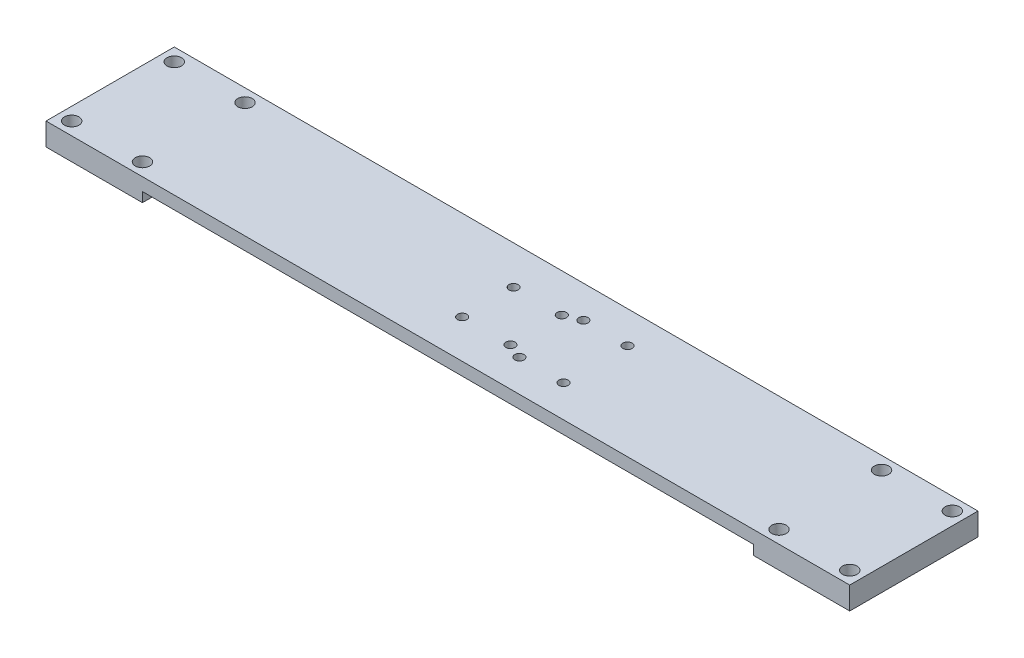
ISO-10303-21;
HEADER;
FILE_DESCRIPTION(('STEP AP214'),'2;1');
FILE_NAME('part.step','',(''),(''),'','','');
FILE_SCHEMA(('AUTOMOTIVE_DESIGN { 1 0 10303 214 1 1 1 1 }'));
ENDSEC;
DATA;
#1=APPLICATION_CONTEXT('core data for automotive mechanical design processes');
#2=APPLICATION_PROTOCOL_DEFINITION('international standard','automotive_design',2000,#1);
#3=PRODUCT_CONTEXT('',#1,'mechanical');
#4=PRODUCT('Part','Part','',(#3));
#5=PRODUCT_RELATED_PRODUCT_CATEGORY('part','',(#4));
#6=PRODUCT_DEFINITION_FORMATION('','',#4);
#7=PRODUCT_DEFINITION_CONTEXT('part definition',#1,'design');
#8=PRODUCT_DEFINITION('design','',#6,#7);
#9=PRODUCT_DEFINITION_SHAPE('','',#8);
#10=(LENGTH_UNIT() NAMED_UNIT(*) SI_UNIT(.MILLI.,.METRE.));
#11=(NAMED_UNIT(*) PLANE_ANGLE_UNIT() SI_UNIT($,.RADIAN.));
#12=(NAMED_UNIT(*) SI_UNIT($,.STERADIAN.) SOLID_ANGLE_UNIT());
#13=UNCERTAINTY_MEASURE_WITH_UNIT(LENGTH_MEASURE(1.E-05),#10,'distance_accuracy_value','');
#14=(GEOMETRIC_REPRESENTATION_CONTEXT(3) GLOBAL_UNCERTAINTY_ASSIGNED_CONTEXT((#13)) GLOBAL_UNIT_ASSIGNED_CONTEXT((#10,
#11,#12)) REPRESENTATION_CONTEXT('',''));
#15=CARTESIAN_POINT('',(0.,0.,0.));
#16=DIRECTION('',(0.,0.,1.));
#17=DIRECTION('',(1.,0.,0.));
#18=AXIS2_PLACEMENT_3D('',#15,#16,#17);
#19=CARTESIAN_POINT('',(0.,0.,0.));
#20=DIRECTION('',(0.,1.,0.));
#21=DIRECTION('',(0.,0.,1.));
#22=AXIS2_PLACEMENT_3D('',#19,#20,#21);
#23=PLANE('',#22);
#24=CARTESIAN_POINT('',(-112.75,3.88578058618805E-13,-29.8999999999996));
#25=DIRECTION('',(0.,-1.,0.));
#26=DIRECTION('',(0.,0.,-1.));
#27=AXIS2_PLACEMENT_3D('',#24,#25,#26);
#28=CIRCLE('',#27,1.45000000000001);
#29=CARTESIAN_POINT('',(-112.75,3.88578058618805E-13,-31.3499999999996));
#30=VERTEX_POINT('',#29);
#31=EDGE_CURVE('E212',#30,#30,#28,.T.);
#32=ORIENTED_EDGE('',*,*,#31,.F.);
#33=EDGE_LOOP('',(#32));
#34=FACE_BOUND('',#33,.T.);
#35=CARTESIAN_POINT('',(-98.9999999999999,3.88578058618805E-13,-9.99999999999993));
#36=DIRECTION('',(0.,-1.,0.));
#37=DIRECTION('',(0.,0.,-1.));
#38=AXIS2_PLACEMENT_3D('',#35,#36,#37);
#39=CIRCLE('',#38,1.44999999999997);
#40=CARTESIAN_POINT('',(-98.9999999999999,3.88578058618805E-13,-11.4499999999999));
#41=VERTEX_POINT('',#40);
#42=EDGE_CURVE('E211',#41,#41,#39,.T.);
#43=ORIENTED_EDGE('',*,*,#42,.F.);
#44=EDGE_LOOP('',(#43));
#45=FACE_BOUND('',#44,.T.);
#46=CARTESIAN_POINT('',(-98.9999999999999,3.88578058618805E-13,-29.8999999999996));
#47=DIRECTION('',(0.,-1.,0.));
#48=DIRECTION('',(0.,0.,-1.));
#49=AXIS2_PLACEMENT_3D('',#46,#47,#48);
#50=CIRCLE('',#49,1.45000000000002);
#51=CARTESIAN_POINT('',(-98.9999999999999,3.88578058618805E-13,-31.3499999999996));
#52=VERTEX_POINT('',#51);
#53=EDGE_CURVE('E208',#52,#52,#50,.T.);
#54=ORIENTED_EDGE('',*,*,#53,.F.);
#55=EDGE_LOOP('',(#54));
#56=FACE_BOUND('',#55,.T.);
#57=CARTESIAN_POINT('',(-112.75,3.88578058618805E-13,-10.));
#58=DIRECTION('',(0.,-1.,0.));
#59=DIRECTION('',(0.,0.,-1.));
#60=AXIS2_PLACEMENT_3D('',#57,#58,#59);
#61=CIRCLE('',#60,1.45000000000003);
#62=CARTESIAN_POINT('',(-112.75,3.88578058618805E-13,-11.45));
#63=VERTEX_POINT('',#62);
#64=EDGE_CURVE('E215',#63,#63,#61,.T.);
#65=ORIENTED_EDGE('',*,*,#64,.F.);
#66=EDGE_LOOP('',(#65));
#67=FACE_BOUND('',#66,.T.);
#68=CARTESIAN_POINT('',(-132.5,0.,-11.95));
#69=DIRECTION('',(0.,1.,0.));
#70=DIRECTION('',(0.,0.,1.));
#71=AXIS2_PLACEMENT_3D('',#68,#69,#70);
#72=CIRCLE('',#71,1.45);
#73=CARTESIAN_POINT('',(-132.5,0.,-10.5));
#74=VERTEX_POINT('',#73);
#75=EDGE_CURVE('E254',#74,#74,#72,.T.);
#76=ORIENTED_EDGE('',*,*,#75,.T.);
#77=EDGE_LOOP('',(#76));
#78=FACE_BOUND('',#77,.T.);
#79=CARTESIAN_POINT('',(-117.5,0.,-11.95));
#80=DIRECTION('',(0.,1.,0.));
#81=DIRECTION('',(0.,0.,1.));
#82=AXIS2_PLACEMENT_3D('',#79,#80,#81);
#83=CIRCLE('',#82,1.45);
#84=CARTESIAN_POINT('',(-117.5,0.,-10.5));
#85=VERTEX_POINT('',#84);
#86=EDGE_CURVE('E264',#85,#85,#83,.T.);
#87=ORIENTED_EDGE('',*,*,#86,.T.);
#88=EDGE_LOOP('',(#87));
#89=FACE_BOUND('',#88,.T.);
#90=CARTESIAN_POINT('',(-117.5,0.,-27.95));
#91=DIRECTION('',(0.,1.,0.));
#92=DIRECTION('',(0.,0.,1.));
#93=AXIS2_PLACEMENT_3D('',#90,#91,#92);
#94=CIRCLE('',#93,1.45);
#95=CARTESIAN_POINT('',(-117.5,0.,-26.5));
#96=VERTEX_POINT('',#95);
#97=EDGE_CURVE('E261',#96,#96,#94,.T.);
#98=ORIENTED_EDGE('',*,*,#97,.T.);
#99=EDGE_LOOP('',(#98));
#100=FACE_BOUND('',#99,.T.);
#101=CARTESIAN_POINT('',(-132.5,0.,-27.95));
#102=DIRECTION('',(0.,1.,0.));
#103=DIRECTION('',(0.,0.,1.));
#104=AXIS2_PLACEMENT_3D('',#101,#102,#103);
#105=CIRCLE('',#104,1.45);
#106=CARTESIAN_POINT('',(-132.5,0.,-26.5));
#107=VERTEX_POINT('',#106);
#108=EDGE_CURVE('E244',#107,#107,#105,.T.);
#109=ORIENTED_EDGE('',*,*,#108,.T.);
#110=EDGE_LOOP('',(#109));
#111=FACE_BOUND('',#110,.T.);
#112=DIRECTION('',(0.,0.,-1.));
#113=VECTOR('',#112,1.);
#114=CARTESIAN_POINT('',(-30.,0.,0.));
#115=LINE('',#114,#113);
#116=CARTESIAN_POINT('',(-30.,0.,0.));
#117=VERTEX_POINT('',#116);
#118=CARTESIAN_POINT('',(-30.,0.,-39.9));
#119=VERTEX_POINT('',#118);
#120=EDGE_CURVE('E170',#117,#119,#115,.T.);
#121=ORIENTED_EDGE('',*,*,#120,.F.);
#122=DIRECTION('',(1.,0.,0.));
#123=VECTOR('',#122,1.);
#124=CARTESIAN_POINT('',(0.,0.,0.));
#125=LINE('',#124,#123);
#126=CARTESIAN_POINT('',(-220.,0.,0.));
#127=VERTEX_POINT('',#126);
#128=EDGE_CURVE('E248',#127,#117,#125,.T.);
#129=ORIENTED_EDGE('',*,*,#128,.F.);
#130=DIRECTION('',(0.,0.,1.));
#131=VECTOR('',#130,1.);
#132=CARTESIAN_POINT('',(-220.,0.,0.));
#133=LINE('',#132,#131);
#134=CARTESIAN_POINT('',(-220.,0.,-39.9));
#135=VERTEX_POINT('',#134);
#136=EDGE_CURVE('E176',#135,#127,#133,.T.);
#137=ORIENTED_EDGE('',*,*,#136,.F.);
#138=DIRECTION('',(-1.,0.,0.));
#139=VECTOR('',#138,1.);
#140=CARTESIAN_POINT('',(0.,0.,-39.9));
#141=LINE('',#140,#139);
#142=EDGE_CURVE('E51',#119,#135,#141,.T.);
#143=ORIENTED_EDGE('',*,*,#142,.F.);
#144=EDGE_LOOP('',(#121,#129,#137,#143));
#145=FACE_BOUND('',#144,.T.);
#146=ADVANCED_FACE('F34',(#34,#45,#56,#67,#78,#89,#100,#111,#145),#23,.F.);
#147=CARTESIAN_POINT('',(0.,4.,0.));
#148=DIRECTION('',(-1.,0.,0.));
#149=DIRECTION('',(0.,0.,1.));
#150=AXIS2_PLACEMENT_3D('',#147,#148,#149);
#151=PLANE('',#150);
#152=DIRECTION('',(0.,-1.,0.));
#153=VECTOR('',#152,1.);
#154=CARTESIAN_POINT('',(0.,4.,0.));
#155=LINE('',#154,#153);
#156=CARTESIAN_POINT('',(0.,4.,0.));
#157=VERTEX_POINT('',#156);
#158=CARTESIAN_POINT('',(0.,-3.,0.));
#159=VERTEX_POINT('',#158);
#160=EDGE_CURVE('E110',#157,#159,#155,.T.);
#161=ORIENTED_EDGE('',*,*,#160,.T.);
#162=DIRECTION('',(0.,0.,1.));
#163=VECTOR('',#162,1.);
#164=CARTESIAN_POINT('',(0.,-3.,-39.9));
#165=LINE('',#164,#163);
#166=CARTESIAN_POINT('',(0.,-3.,-39.9));
#167=VERTEX_POINT('',#166);
#168=EDGE_CURVE('E149',#167,#159,#165,.T.);
#169=ORIENTED_EDGE('',*,*,#168,.F.);
#170=DIRECTION('',(0.,-1.,0.));
#171=VECTOR('',#170,1.);
#172=CARTESIAN_POINT('',(0.,4.,-39.9));
#173=LINE('',#172,#171);
#174=CARTESIAN_POINT('',(0.,4.,-39.9));
#175=VERTEX_POINT('',#174);
#176=EDGE_CURVE('E11',#175,#167,#173,.T.);
#177=ORIENTED_EDGE('',*,*,#176,.F.);
#178=DIRECTION('',(0.,0.,-1.));
#179=VECTOR('',#178,1.);
#180=CARTESIAN_POINT('',(0.,4.,0.));
#181=LINE('',#180,#179);
#182=EDGE_CURVE('E245',#157,#175,#181,.T.);
#183=ORIENTED_EDGE('',*,*,#182,.F.);
#184=EDGE_LOOP('',(#161,#169,#177,#183));
#185=FACE_BOUND('',#184,.T.);
#186=ADVANCED_FACE('F36',(#185),#151,.F.);
#187=CARTESIAN_POINT('',(0.,4.,-39.9));
#188=DIRECTION('',(0.,0.,1.));
#189=DIRECTION('',(1.,0.,0.));
#190=AXIS2_PLACEMENT_3D('',#187,#188,#189);
#191=PLANE('',#190);
#192=ORIENTED_EDGE('',*,*,#176,.T.);
#193=DIRECTION('',(1.,0.,0.));
#194=VECTOR('',#193,1.);
#195=CARTESIAN_POINT('',(-30.,-3.,-39.9));
#196=LINE('',#195,#194);
#197=CARTESIAN_POINT('',(-30.,-3.,-39.9));
#198=VERTEX_POINT('',#197);
#199=EDGE_CURVE('E146',#198,#167,#196,.T.);
#200=ORIENTED_EDGE('',*,*,#199,.F.);
#201=DIRECTION('',(0.,1.,0.));
#202=VECTOR('',#201,1.);
#203=CARTESIAN_POINT('',(-30.,-1.,-39.9));
#204=LINE('',#203,#202);
#205=EDGE_CURVE('E172',#198,#119,#204,.T.);
#206=ORIENTED_EDGE('',*,*,#205,.T.);
#207=ORIENTED_EDGE('',*,*,#142,.T.);
#208=DIRECTION('',(0.,1.,0.));
#209=VECTOR('',#208,1.);
#210=CARTESIAN_POINT('',(-220.,-1.,-39.9));
#211=LINE('',#210,#209);
#212=CARTESIAN_POINT('',(-220.,-3.,-39.9));
#213=VERTEX_POINT('',#212);
#214=EDGE_CURVE('E181',#213,#135,#211,.T.);
#215=ORIENTED_EDGE('',*,*,#214,.F.);
#216=DIRECTION('',(1.,0.,0.));
#217=VECTOR('',#216,1.);
#218=CARTESIAN_POINT('',(-250.,-3.,-39.9));
#219=LINE('',#218,#217);
#220=CARTESIAN_POINT('',(-250.,-3.,-39.9));
#221=VERTEX_POINT('',#220);
#222=EDGE_CURVE('E119',#221,#213,#219,.T.);
#223=ORIENTED_EDGE('',*,*,#222,.F.);
#224=DIRECTION('',(0.,-1.,0.));
#225=VECTOR('',#224,1.);
#226=CARTESIAN_POINT('',(-250.,4.,-39.9));
#227=LINE('',#226,#225);
#228=CARTESIAN_POINT('',(-250.,4.,-39.9));
#229=VERTEX_POINT('',#228);
#230=EDGE_CURVE('E43',#229,#221,#227,.T.);
#231=ORIENTED_EDGE('',*,*,#230,.F.);
#232=DIRECTION('',(-1.,0.,0.));
#233=VECTOR('',#232,1.);
#234=CARTESIAN_POINT('',(0.,4.,-39.9));
#235=LINE('',#234,#233);
#236=EDGE_CURVE('E247',#175,#229,#235,.T.);
#237=ORIENTED_EDGE('',*,*,#236,.F.);
#238=EDGE_LOOP('',(#192,#200,#206,#207,#215,#223,#231,#237));
#239=FACE_BOUND('',#238,.T.);
#240=ADVANCED_FACE('F307',(#239),#191,.F.);
#241=CARTESIAN_POINT('',(-250.,4.,0.));
#242=DIRECTION('',(1.,0.,0.));
#243=DIRECTION('',(0.,0.,-1.));
#244=AXIS2_PLACEMENT_3D('',#241,#242,#243);
#245=PLANE('',#244);
#246=ORIENTED_EDGE('',*,*,#230,.T.);
#247=DIRECTION('',(0.,0.,-1.));
#248=VECTOR('',#247,1.);
#249=CARTESIAN_POINT('',(-250.,-3.,0.));
#250=LINE('',#249,#248);
#251=CARTESIAN_POINT('',(-250.,-3.,0.));
#252=VERTEX_POINT('',#251);
#253=EDGE_CURVE('E113',#252,#221,#250,.T.);
#254=ORIENTED_EDGE('',*,*,#253,.F.);
#255=DIRECTION('',(0.,-1.,0.));
#256=VECTOR('',#255,1.);
#257=CARTESIAN_POINT('',(-250.,4.,0.));
#258=LINE('',#257,#256);
#259=CARTESIAN_POINT('',(-250.,4.,0.));
#260=VERTEX_POINT('',#259);
#261=EDGE_CURVE('E102',#260,#252,#258,.T.);
#262=ORIENTED_EDGE('',*,*,#261,.F.);
#263=DIRECTION('',(0.,0.,1.));
#264=VECTOR('',#263,1.);
#265=CARTESIAN_POINT('',(-250.,4.,0.));
#266=LINE('',#265,#264);
#267=EDGE_CURVE('E250',#229,#260,#266,.T.);
#268=ORIENTED_EDGE('',*,*,#267,.F.);
#269=EDGE_LOOP('',(#246,#254,#262,#268));
#270=FACE_BOUND('',#269,.T.);
#271=ADVANCED_FACE('F114',(#270),#245,.F.);
#272=CARTESIAN_POINT('',(0.,4.,0.));
#273=DIRECTION('',(0.,0.,-1.));
#274=DIRECTION('',(-1.,0.,0.));
#275=AXIS2_PLACEMENT_3D('',#272,#273,#274);
#276=PLANE('',#275);
#277=ORIENTED_EDGE('',*,*,#261,.T.);
#278=DIRECTION('',(-1.,0.,0.));
#279=VECTOR('',#278,1.);
#280=CARTESIAN_POINT('',(-220.,-3.,0.));
#281=LINE('',#280,#279);
#282=CARTESIAN_POINT('',(-220.,-3.,0.));
#283=VERTEX_POINT('',#282);
#284=EDGE_CURVE('E107',#283,#252,#281,.T.);
#285=ORIENTED_EDGE('',*,*,#284,.F.);
#286=DIRECTION('',(0.,1.,0.));
#287=VECTOR('',#286,1.);
#288=CARTESIAN_POINT('',(-220.,-1.,0.));
#289=LINE('',#288,#287);
#290=EDGE_CURVE('E179',#283,#127,#289,.T.);
#291=ORIENTED_EDGE('',*,*,#290,.T.);
#292=ORIENTED_EDGE('',*,*,#128,.T.);
#293=DIRECTION('',(0.,1.,0.));
#294=VECTOR('',#293,1.);
#295=CARTESIAN_POINT('',(-30.,-1.,0.));
#296=LINE('',#295,#294);
#297=CARTESIAN_POINT('',(-30.,-3.,0.));
#298=VERTEX_POINT('',#297);
#299=EDGE_CURVE('E174',#298,#117,#296,.T.);
#300=ORIENTED_EDGE('',*,*,#299,.F.);
#301=DIRECTION('',(-1.,0.,0.));
#302=VECTOR('',#301,1.);
#303=CARTESIAN_POINT('',(0.,-3.,0.));
#304=LINE('',#303,#302);
#305=EDGE_CURVE('E152',#159,#298,#304,.T.);
#306=ORIENTED_EDGE('',*,*,#305,.F.);
#307=ORIENTED_EDGE('',*,*,#160,.F.);
#308=DIRECTION('',(1.,0.,0.));
#309=VECTOR('',#308,1.);
#310=CARTESIAN_POINT('',(0.,4.,0.));
#311=LINE('',#310,#309);
#312=EDGE_CURVE('E59',#260,#157,#311,.T.);
#313=ORIENTED_EDGE('',*,*,#312,.F.);
#314=EDGE_LOOP('',(#277,#285,#291,#292,#300,#306,#307,#313));
#315=FACE_BOUND('',#314,.T.);
#316=ADVANCED_FACE('F104',(#315),#276,.F.);
#317=CARTESIAN_POINT('',(0.,4.,0.));
#318=DIRECTION('',(0.,1.,0.));
#319=DIRECTION('',(0.,0.,1.));
#320=AXIS2_PLACEMENT_3D('',#317,#318,#319);
#321=PLANE('',#320);
#322=CARTESIAN_POINT('',(-4.,4.,-3.99999999999998));
#323=DIRECTION('',(0.,1.,0.));
#324=DIRECTION('',(0.,0.,1.));
#325=AXIS2_PLACEMENT_3D('',#322,#323,#324);
#326=CIRCLE('',#325,2.25);
#327=CARTESIAN_POINT('',(-4.,4.,-1.74999999999998));
#328=VERTEX_POINT('',#327);
#329=EDGE_CURVE('E188',#328,#328,#326,.T.);
#330=ORIENTED_EDGE('',*,*,#329,.F.);
#331=EDGE_LOOP('',(#330));
#332=FACE_BOUND('',#331,.T.);
#333=CARTESIAN_POINT('',(-246.,4.,-4.00000000000005));
#334=DIRECTION('',(0.,1.,0.));
#335=DIRECTION('',(0.,0.,-1.));
#336=AXIS2_PLACEMENT_3D('',#333,#334,#335);
#337=CIRCLE('',#336,2.25000000000001);
#338=CARTESIAN_POINT('',(-246.,4.,-6.25000000000006));
#339=VERTEX_POINT('',#338);
#340=EDGE_CURVE('E194',#339,#339,#337,.T.);
#341=ORIENTED_EDGE('',*,*,#340,.F.);
#342=EDGE_LOOP('',(#341));
#343=FACE_BOUND('',#342,.T.);
#344=CARTESIAN_POINT('',(-224.,4.,-4.00000000000005));
#345=DIRECTION('',(0.,1.,0.));
#346=DIRECTION('',(0.,0.,-1.));
#347=AXIS2_PLACEMENT_3D('',#344,#345,#346);
#348=CIRCLE('',#347,2.25000000000001);
#349=CARTESIAN_POINT('',(-224.,4.,-6.25000000000006));
#350=VERTEX_POINT('',#349);
#351=EDGE_CURVE('E197',#350,#350,#348,.T.);
#352=ORIENTED_EDGE('',*,*,#351,.F.);
#353=EDGE_LOOP('',(#352));
#354=FACE_BOUND('',#353,.T.);
#355=CARTESIAN_POINT('',(-224.,4.,-35.8999999999999));
#356=DIRECTION('',(0.,1.,0.));
#357=DIRECTION('',(0.,0.,1.));
#358=AXIS2_PLACEMENT_3D('',#355,#356,#357);
#359=CIRCLE('',#358,2.25000000000001);
#360=CARTESIAN_POINT('',(-224.,4.,-33.6499999999999));
#361=VERTEX_POINT('',#360);
#362=EDGE_CURVE('E200',#361,#361,#359,.T.);
#363=ORIENTED_EDGE('',*,*,#362,.F.);
#364=EDGE_LOOP('',(#363));
#365=FACE_BOUND('',#364,.T.);
#366=CARTESIAN_POINT('',(-26.,4.,-3.99999999999998));
#367=DIRECTION('',(0.,1.,0.));
#368=DIRECTION('',(0.,0.,1.));
#369=AXIS2_PLACEMENT_3D('',#366,#367,#368);
#370=CIRCLE('',#369,2.25);
#371=CARTESIAN_POINT('',(-26.,4.,-1.74999999999998));
#372=VERTEX_POINT('',#371);
#373=EDGE_CURVE('E185',#372,#372,#370,.T.);
#374=ORIENTED_EDGE('',*,*,#373,.F.);
#375=EDGE_LOOP('',(#374));
#376=FACE_BOUND('',#375,.T.);
#377=CARTESIAN_POINT('',(-26.,4.,-35.9));
#378=DIRECTION('',(0.,1.,0.));
#379=DIRECTION('',(0.,0.,-1.));
#380=AXIS2_PLACEMENT_3D('',#377,#378,#379);
#381=CIRCLE('',#380,2.25);
#382=CARTESIAN_POINT('',(-26.,4.,-38.15));
#383=VERTEX_POINT('',#382);
#384=EDGE_CURVE('E189',#383,#383,#381,.T.);
#385=ORIENTED_EDGE('',*,*,#384,.F.);
#386=EDGE_LOOP('',(#385));
#387=FACE_BOUND('',#386,.T.);
#388=CARTESIAN_POINT('',(-4.,4.,-35.9));
#389=DIRECTION('',(0.,1.,0.));
#390=DIRECTION('',(0.,0.,-1.));
#391=AXIS2_PLACEMENT_3D('',#388,#389,#390);
#392=CIRCLE('',#391,2.25);
#393=CARTESIAN_POINT('',(-4.,4.,-38.15));
#394=VERTEX_POINT('',#393);
#395=EDGE_CURVE('E184',#394,#394,#392,.T.);
#396=ORIENTED_EDGE('',*,*,#395,.F.);
#397=EDGE_LOOP('',(#396));
#398=FACE_BOUND('',#397,.T.);
#399=CARTESIAN_POINT('',(-246.,4.,-35.8999999999999));
#400=DIRECTION('',(0.,1.,0.));
#401=DIRECTION('',(0.,0.,1.));
#402=AXIS2_PLACEMENT_3D('',#399,#400,#401);
#403=CIRCLE('',#402,2.25000000000001);
#404=CARTESIAN_POINT('',(-246.,4.,-33.6499999999999));
#405=VERTEX_POINT('',#404);
#406=EDGE_CURVE('E203',#405,#405,#403,.T.);
#407=ORIENTED_EDGE('',*,*,#406,.F.);
#408=EDGE_LOOP('',(#407));
#409=FACE_BOUND('',#408,.T.);
#410=CARTESIAN_POINT('',(-112.75,4.,-29.8999999999996));
#411=DIRECTION('',(0.,1.,0.));
#412=DIRECTION('',(0.,0.,1.));
#413=AXIS2_PLACEMENT_3D('',#410,#411,#412);
#414=CIRCLE('',#413,1.45000000000001);
#415=CARTESIAN_POINT('',(-112.75,4.,-28.4499999999996));
#416=VERTEX_POINT('',#415);
#417=EDGE_CURVE('E229',#416,#416,#414,.T.);
#418=ORIENTED_EDGE('',*,*,#417,.F.);
#419=EDGE_LOOP('',(#418));
#420=FACE_BOUND('',#419,.T.);
#421=CARTESIAN_POINT('',(-98.9999999999999,4.,-9.99999999999993));
#422=DIRECTION('',(0.,1.,0.));
#423=DIRECTION('',(0.,0.,1.));
#424=AXIS2_PLACEMENT_3D('',#421,#422,#423);
#425=CIRCLE('',#424,1.44999999999997);
#426=CARTESIAN_POINT('',(-98.9999999999999,4.,-8.54999999999995));
#427=VERTEX_POINT('',#426);
#428=EDGE_CURVE('E226',#427,#427,#425,.T.);
#429=ORIENTED_EDGE('',*,*,#428,.F.);
#430=EDGE_LOOP('',(#429));
#431=FACE_BOUND('',#430,.T.);
#432=CARTESIAN_POINT('',(-98.9999999999999,4.,-29.8999999999996));
#433=DIRECTION('',(0.,1.,0.));
#434=DIRECTION('',(0.,0.,1.));
#435=AXIS2_PLACEMENT_3D('',#432,#433,#434);
#436=CIRCLE('',#435,1.45000000000002);
#437=CARTESIAN_POINT('',(-98.9999999999999,4.,-28.4499999999995));
#438=VERTEX_POINT('',#437);
#439=EDGE_CURVE('E223',#438,#438,#436,.T.);
#440=ORIENTED_EDGE('',*,*,#439,.F.);
#441=EDGE_LOOP('',(#440));
#442=FACE_BOUND('',#441,.T.);
#443=CARTESIAN_POINT('',(-112.75,4.,-10.));
#444=DIRECTION('',(0.,1.,0.));
#445=DIRECTION('',(0.,0.,1.));
#446=AXIS2_PLACEMENT_3D('',#443,#444,#445);
#447=CIRCLE('',#446,1.45000000000003);
#448=CARTESIAN_POINT('',(-112.75,4.,-8.54999999999998));
#449=VERTEX_POINT('',#448);
#450=EDGE_CURVE('E220',#449,#449,#447,.T.);
#451=ORIENTED_EDGE('',*,*,#450,.F.);
#452=EDGE_LOOP('',(#451));
#453=FACE_BOUND('',#452,.T.);
#454=CARTESIAN_POINT('',(-132.5,4.,-11.95));
#455=DIRECTION('',(0.,1.,0.));
#456=DIRECTION('',(0.,0.,1.));
#457=AXIS2_PLACEMENT_3D('',#454,#455,#456);
#458=CIRCLE('',#457,1.45);
#459=CARTESIAN_POINT('',(-132.5,4.,-10.5));
#460=VERTEX_POINT('',#459);
#461=EDGE_CURVE('E232',#460,#460,#458,.T.);
#462=ORIENTED_EDGE('',*,*,#461,.F.);
#463=EDGE_LOOP('',(#462));
#464=FACE_BOUND('',#463,.T.);
#465=CARTESIAN_POINT('',(-117.5,4.,-11.95));
#466=DIRECTION('',(0.,1.,0.));
#467=DIRECTION('',(0.,0.,1.));
#468=AXIS2_PLACEMENT_3D('',#465,#466,#467);
#469=CIRCLE('',#468,1.45);
#470=CARTESIAN_POINT('',(-117.5,4.,-10.5));
#471=VERTEX_POINT('',#470);
#472=EDGE_CURVE('E237',#471,#471,#469,.T.);
#473=ORIENTED_EDGE('',*,*,#472,.F.);
#474=EDGE_LOOP('',(#473));
#475=FACE_BOUND('',#474,.T.);
#476=CARTESIAN_POINT('',(-117.5,4.,-27.95));
#477=DIRECTION('',(0.,1.,0.));
#478=DIRECTION('',(0.,0.,1.));
#479=AXIS2_PLACEMENT_3D('',#476,#477,#478);
#480=CIRCLE('',#479,1.45);
#481=CARTESIAN_POINT('',(-117.5,4.,-26.5));
#482=VERTEX_POINT('',#481);
#483=EDGE_CURVE('E233',#482,#482,#480,.T.);
#484=ORIENTED_EDGE('',*,*,#483,.F.);
#485=EDGE_LOOP('',(#484));
#486=FACE_BOUND('',#485,.T.);
#487=CARTESIAN_POINT('',(-132.5,4.,-27.95));
#488=DIRECTION('',(0.,1.,0.));
#489=DIRECTION('',(0.,0.,1.));
#490=AXIS2_PLACEMENT_3D('',#487,#488,#489);
#491=CIRCLE('',#490,1.45);
#492=CARTESIAN_POINT('',(-132.5,4.,-26.5));
#493=VERTEX_POINT('',#492);
#494=EDGE_CURVE('E236',#493,#493,#491,.T.);
#495=ORIENTED_EDGE('',*,*,#494,.F.);
#496=EDGE_LOOP('',(#495));
#497=FACE_BOUND('',#496,.T.);
#498=ORIENTED_EDGE('',*,*,#182,.T.);
#499=ORIENTED_EDGE('',*,*,#236,.T.);
#500=ORIENTED_EDGE('',*,*,#267,.T.);
#501=ORIENTED_EDGE('',*,*,#312,.T.);
#502=EDGE_LOOP('',(#498,#499,#500,#501));
#503=FACE_BOUND('',#502,.T.);
#504=ADVANCED_FACE('F316',(#332,#343,#354,#365,#376,#387,#398,#409,#420,#431,#442,#453,#464,
#475,#486,#497,#503),#321,.T.);
#505=CARTESIAN_POINT('',(-132.5,-8.,-27.95));
#506=DIRECTION('',(0.,1.,0.));
#507=DIRECTION('',(0.,0.,1.));
#508=AXIS2_PLACEMENT_3D('',#505,#506,#507);
#509=CYLINDRICAL_SURFACE('',#508,1.45);
#510=ORIENTED_EDGE('',*,*,#494,.T.);
#511=EDGE_LOOP('',(#510));
#512=FACE_BOUND('',#511,.T.);
#513=ORIENTED_EDGE('',*,*,#108,.F.);
#514=EDGE_LOOP('',(#513));
#515=FACE_BOUND('',#514,.T.);
#516=ADVANCED_FACE('F318',(#512,#515),#509,.F.);
#517=CARTESIAN_POINT('',(-117.5,-8.,-27.95));
#518=DIRECTION('',(0.,1.,0.));
#519=DIRECTION('',(0.,0.,1.));
#520=AXIS2_PLACEMENT_3D('',#517,#518,#519);
#521=CYLINDRICAL_SURFACE('',#520,1.45);
#522=ORIENTED_EDGE('',*,*,#483,.T.);
#523=EDGE_LOOP('',(#522));
#524=FACE_BOUND('',#523,.T.);
#525=ORIENTED_EDGE('',*,*,#97,.F.);
#526=EDGE_LOOP('',(#525));
#527=FACE_BOUND('',#526,.T.);
#528=ADVANCED_FACE('F325',(#524,#527),#521,.F.);
#529=CARTESIAN_POINT('',(-117.5,-8.,-11.95));
#530=DIRECTION('',(0.,1.,0.));
#531=DIRECTION('',(0.,0.,1.));
#532=AXIS2_PLACEMENT_3D('',#529,#530,#531);
#533=CYLINDRICAL_SURFACE('',#532,1.45);
#534=ORIENTED_EDGE('',*,*,#472,.T.);
#535=EDGE_LOOP('',(#534));
#536=FACE_BOUND('',#535,.T.);
#537=ORIENTED_EDGE('',*,*,#86,.F.);
#538=EDGE_LOOP('',(#537));
#539=FACE_BOUND('',#538,.T.);
#540=ADVANCED_FACE('F596',(#536,#539),#533,.F.);
#541=CARTESIAN_POINT('',(-132.5,-8.,-11.95));
#542=DIRECTION('',(0.,1.,0.));
#543=DIRECTION('',(0.,0.,1.));
#544=AXIS2_PLACEMENT_3D('',#541,#542,#543);
#545=CYLINDRICAL_SURFACE('',#544,1.45);
#546=ORIENTED_EDGE('',*,*,#461,.T.);
#547=EDGE_LOOP('',(#546));
#548=FACE_BOUND('',#547,.T.);
#549=ORIENTED_EDGE('',*,*,#75,.F.);
#550=EDGE_LOOP('',(#549));
#551=FACE_BOUND('',#550,.T.);
#552=ADVANCED_FACE('F592',(#548,#551),#545,.F.);
#553=CARTESIAN_POINT('',(-112.75,12.0000000000004,-10.));
#554=DIRECTION('',(0.,-1.,0.));
#555=DIRECTION('',(0.,0.,-1.));
#556=AXIS2_PLACEMENT_3D('',#553,#554,#555);
#557=CYLINDRICAL_SURFACE('',#556,1.45000000000003);
#558=ORIENTED_EDGE('',*,*,#450,.T.);
#559=EDGE_LOOP('',(#558));
#560=FACE_BOUND('',#559,.T.);
#561=ORIENTED_EDGE('',*,*,#64,.T.);
#562=EDGE_LOOP('',(#561));
#563=FACE_BOUND('',#562,.T.);
#564=ADVANCED_FACE('F582',(#560,#563),#557,.F.);
#565=CARTESIAN_POINT('',(-98.9999999999999,12.0000000000004,-29.8999999999996));
#566=DIRECTION('',(0.,-1.,0.));
#567=DIRECTION('',(0.,0.,-1.));
#568=AXIS2_PLACEMENT_3D('',#565,#566,#567);
#569=CYLINDRICAL_SURFACE('',#568,1.45000000000002);
#570=ORIENTED_EDGE('',*,*,#439,.T.);
#571=EDGE_LOOP('',(#570));
#572=FACE_BOUND('',#571,.T.);
#573=ORIENTED_EDGE('',*,*,#53,.T.);
#574=EDGE_LOOP('',(#573));
#575=FACE_BOUND('',#574,.T.);
#576=ADVANCED_FACE('F578',(#572,#575),#569,.F.);
#577=CARTESIAN_POINT('',(-98.9999999999999,12.0000000000004,-9.99999999999993));
#578=DIRECTION('',(0.,-1.,0.));
#579=DIRECTION('',(0.,0.,-1.));
#580=AXIS2_PLACEMENT_3D('',#577,#578,#579);
#581=CYLINDRICAL_SURFACE('',#580,1.44999999999997);
#582=ORIENTED_EDGE('',*,*,#428,.T.);
#583=EDGE_LOOP('',(#582));
#584=FACE_BOUND('',#583,.T.);
#585=ORIENTED_EDGE('',*,*,#42,.T.);
#586=EDGE_LOOP('',(#585));
#587=FACE_BOUND('',#586,.T.);
#588=ADVANCED_FACE('F581',(#584,#587),#581,.F.);
#589=CARTESIAN_POINT('',(-112.75,12.0000000000004,-29.8999999999996));
#590=DIRECTION('',(0.,-1.,0.));
#591=DIRECTION('',(0.,0.,-1.));
#592=AXIS2_PLACEMENT_3D('',#589,#590,#591);
#593=CYLINDRICAL_SURFACE('',#592,1.45000000000001);
#594=ORIENTED_EDGE('',*,*,#417,.T.);
#595=EDGE_LOOP('',(#594));
#596=FACE_BOUND('',#595,.T.);
#597=ORIENTED_EDGE('',*,*,#31,.T.);
#598=EDGE_LOOP('',(#597));
#599=FACE_BOUND('',#598,.T.);
#600=ADVANCED_FACE('F576',(#596,#599),#593,.F.);
#601=CARTESIAN_POINT('',(-246.,-16.,-35.8999999999999));
#602=DIRECTION('',(0.,1.,0.));
#603=DIRECTION('',(0.,0.,1.));
#604=AXIS2_PLACEMENT_3D('',#601,#602,#603);
#605=CYLINDRICAL_SURFACE('',#604,2.25000000000001);
#606=ORIENTED_EDGE('',*,*,#406,.T.);
#607=EDGE_LOOP('',(#606));
#608=FACE_BOUND('',#607,.T.);
#609=CARTESIAN_POINT('',(-246.,-1.,-35.8999999999999));
#610=DIRECTION('',(0.,-1.,0.));
#611=DIRECTION('',(0.,0.,-1.));
#612=AXIS2_PLACEMENT_3D('',#609,#610,#611);
#613=CIRCLE('',#612,2.25000000000001);
#614=CARTESIAN_POINT('',(-246.,-1.,-38.1499999999999));
#615=VERTEX_POINT('',#614);
#616=EDGE_CURVE('E143',#615,#615,#613,.F.);
#617=ORIENTED_EDGE('',*,*,#616,.F.);
#618=EDGE_LOOP('',(#617));
#619=FACE_BOUND('',#618,.T.);
#620=ADVANCED_FACE('F559',(#608,#619),#605,.F.);
#621=CARTESIAN_POINT('',(-4.,-16.,-35.9));
#622=DIRECTION('',(0.,1.,0.));
#623=DIRECTION('',(0.,0.,1.));
#624=AXIS2_PLACEMENT_3D('',#621,#622,#623);
#625=CYLINDRICAL_SURFACE('',#624,2.25);
#626=ORIENTED_EDGE('',*,*,#395,.T.);
#627=EDGE_LOOP('',(#626));
#628=FACE_BOUND('',#627,.T.);
#629=CARTESIAN_POINT('',(-4.,-1.,-35.9));
#630=DIRECTION('',(0.,-1.,0.));
#631=DIRECTION('',(0.,0.,-1.));
#632=AXIS2_PLACEMENT_3D('',#629,#630,#631);
#633=CIRCLE('',#632,2.25);
#634=CARTESIAN_POINT('',(-4.,-1.,-38.15));
#635=VERTEX_POINT('',#634);
#636=EDGE_CURVE('E167',#635,#635,#633,.F.);
#637=ORIENTED_EDGE('',*,*,#636,.F.);
#638=EDGE_LOOP('',(#637));
#639=FACE_BOUND('',#638,.T.);
#640=ADVANCED_FACE('F555',(#628,#639),#625,.F.);
#641=CARTESIAN_POINT('',(-26.,-16.,-35.9));
#642=DIRECTION('',(0.,1.,0.));
#643=DIRECTION('',(0.,0.,1.));
#644=AXIS2_PLACEMENT_3D('',#641,#642,#643);
#645=CYLINDRICAL_SURFACE('',#644,2.25);
#646=ORIENTED_EDGE('',*,*,#384,.T.);
#647=EDGE_LOOP('',(#646));
#648=FACE_BOUND('',#647,.T.);
#649=CARTESIAN_POINT('',(-26.,-1.,-35.9));
#650=DIRECTION('',(0.,-1.,0.));
#651=DIRECTION('',(0.,0.,-1.));
#652=AXIS2_PLACEMENT_3D('',#649,#650,#651);
#653=CIRCLE('',#652,2.25);
#654=CARTESIAN_POINT('',(-26.,-1.,-38.15));
#655=VERTEX_POINT('',#654);
#656=EDGE_CURVE('E164',#655,#655,#653,.F.);
#657=ORIENTED_EDGE('',*,*,#656,.F.);
#658=EDGE_LOOP('',(#657));
#659=FACE_BOUND('',#658,.T.);
#660=ADVANCED_FACE('F551',(#648,#659),#645,.F.);
#661=CARTESIAN_POINT('',(-26.,-16.,-3.99999999999998));
#662=DIRECTION('',(0.,1.,0.));
#663=DIRECTION('',(0.,0.,1.));
#664=AXIS2_PLACEMENT_3D('',#661,#662,#663);
#665=CYLINDRICAL_SURFACE('',#664,2.25);
#666=ORIENTED_EDGE('',*,*,#373,.T.);
#667=EDGE_LOOP('',(#666));
#668=FACE_BOUND('',#667,.T.);
#669=CARTESIAN_POINT('',(-26.,-1.,-3.99999999999998));
#670=DIRECTION('',(0.,-1.,0.));
#671=DIRECTION('',(0.,0.,-1.));
#672=AXIS2_PLACEMENT_3D('',#669,#670,#671);
#673=CIRCLE('',#672,2.25);
#674=CARTESIAN_POINT('',(-26.,-1.,-6.24999999999998));
#675=VERTEX_POINT('',#674);
#676=EDGE_CURVE('E161',#675,#675,#673,.F.);
#677=ORIENTED_EDGE('',*,*,#676,.F.);
#678=EDGE_LOOP('',(#677));
#679=FACE_BOUND('',#678,.T.);
#680=ADVANCED_FACE('F547',(#668,#679),#665,.F.);
#681=CARTESIAN_POINT('',(-224.,-16.,-35.8999999999999));
#682=DIRECTION('',(0.,1.,0.));
#683=DIRECTION('',(0.,0.,1.));
#684=AXIS2_PLACEMENT_3D('',#681,#682,#683);
#685=CYLINDRICAL_SURFACE('',#684,2.25000000000001);
#686=ORIENTED_EDGE('',*,*,#362,.T.);
#687=EDGE_LOOP('',(#686));
#688=FACE_BOUND('',#687,.T.);
#689=CARTESIAN_POINT('',(-224.,-1.,-35.8999999999999));
#690=DIRECTION('',(0.,-1.,0.));
#691=DIRECTION('',(0.,0.,-1.));
#692=AXIS2_PLACEMENT_3D('',#689,#690,#691);
#693=CIRCLE('',#692,2.25000000000001);
#694=CARTESIAN_POINT('',(-224.,-1.,-38.1499999999999));
#695=VERTEX_POINT('',#694);
#696=EDGE_CURVE('E140',#695,#695,#693,.F.);
#697=ORIENTED_EDGE('',*,*,#696,.F.);
#698=EDGE_LOOP('',(#697));
#699=FACE_BOUND('',#698,.T.);
#700=ADVANCED_FACE('F550',(#688,#699),#685,.F.);
#701=CARTESIAN_POINT('',(-224.,-16.,-4.00000000000005));
#702=DIRECTION('',(0.,1.,0.));
#703=DIRECTION('',(0.,0.,1.));
#704=AXIS2_PLACEMENT_3D('',#701,#702,#703);
#705=CYLINDRICAL_SURFACE('',#704,2.25000000000001);
#706=ORIENTED_EDGE('',*,*,#351,.T.);
#707=EDGE_LOOP('',(#706));
#708=FACE_BOUND('',#707,.T.);
#709=CARTESIAN_POINT('',(-224.,-1.,-4.00000000000005));
#710=DIRECTION('',(0.,-1.,0.));
#711=DIRECTION('',(0.,0.,-1.));
#712=AXIS2_PLACEMENT_3D('',#709,#710,#711);
#713=CIRCLE('',#712,2.25000000000001);
#714=CARTESIAN_POINT('',(-224.,-1.,-6.25000000000006));
#715=VERTEX_POINT('',#714);
#716=EDGE_CURVE('E137',#715,#715,#713,.F.);
#717=ORIENTED_EDGE('',*,*,#716,.F.);
#718=EDGE_LOOP('',(#717));
#719=FACE_BOUND('',#718,.T.);
#720=ADVANCED_FACE('F564',(#708,#719),#705,.F.);
#721=CARTESIAN_POINT('',(-246.,-16.,-4.00000000000005));
#722=DIRECTION('',(0.,1.,0.));
#723=DIRECTION('',(0.,0.,1.));
#724=AXIS2_PLACEMENT_3D('',#721,#722,#723);
#725=CYLINDRICAL_SURFACE('',#724,2.25000000000001);
#726=ORIENTED_EDGE('',*,*,#340,.T.);
#727=EDGE_LOOP('',(#726));
#728=FACE_BOUND('',#727,.T.);
#729=CARTESIAN_POINT('',(-246.,-1.,-4.00000000000005));
#730=DIRECTION('',(0.,-1.,0.));
#731=DIRECTION('',(0.,0.,-1.));
#732=AXIS2_PLACEMENT_3D('',#729,#730,#731);
#733=CIRCLE('',#732,2.25000000000001);
#734=CARTESIAN_POINT('',(-246.,-1.,-6.25000000000006));
#735=VERTEX_POINT('',#734);
#736=EDGE_CURVE('E134',#735,#735,#733,.F.);
#737=ORIENTED_EDGE('',*,*,#736,.F.);
#738=EDGE_LOOP('',(#737));
#739=FACE_BOUND('',#738,.T.);
#740=ADVANCED_FACE('F561',(#728,#739),#725,.F.);
#741=CARTESIAN_POINT('',(-4.,-16.,-3.99999999999998));
#742=DIRECTION('',(0.,1.,0.));
#743=DIRECTION('',(0.,0.,1.));
#744=AXIS2_PLACEMENT_3D('',#741,#742,#743);
#745=CYLINDRICAL_SURFACE('',#744,2.25);
#746=ORIENTED_EDGE('',*,*,#329,.T.);
#747=EDGE_LOOP('',(#746));
#748=FACE_BOUND('',#747,.T.);
#749=CARTESIAN_POINT('',(-4.,-1.,-3.99999999999998));
#750=DIRECTION('',(0.,-1.,0.));
#751=DIRECTION('',(0.,0.,-1.));
#752=AXIS2_PLACEMENT_3D('',#749,#750,#751);
#753=CIRCLE('',#752,2.25);
#754=CARTESIAN_POINT('',(-4.,-1.,-6.24999999999998));
#755=VERTEX_POINT('',#754);
#756=EDGE_CURVE('E158',#755,#755,#753,.F.);
#757=ORIENTED_EDGE('',*,*,#756,.F.);
#758=EDGE_LOOP('',(#757));
#759=FACE_BOUND('',#758,.T.);
#760=ADVANCED_FACE('F364',(#748,#759),#745,.F.);
#761=CARTESIAN_POINT('',(-220.,-1.,0.));
#762=DIRECTION('',(-1.,0.,0.));
#763=DIRECTION('',(0.,0.,1.));
#764=AXIS2_PLACEMENT_3D('',#761,#762,#763);
#765=PLANE('',#764);
#766=ORIENTED_EDGE('',*,*,#136,.T.);
#767=ORIENTED_EDGE('',*,*,#290,.F.);
#768=DIRECTION('',(0.,0.,1.));
#769=VECTOR('',#768,1.);
#770=CARTESIAN_POINT('',(-220.,-3.,-39.9));
#771=LINE('',#770,#769);
#772=EDGE_CURVE('E124',#213,#283,#771,.T.);
#773=ORIENTED_EDGE('',*,*,#772,.F.);
#774=ORIENTED_EDGE('',*,*,#214,.T.);
#775=EDGE_LOOP('',(#766,#767,#773,#774));
#776=FACE_BOUND('',#775,.T.);
#777=ADVANCED_FACE('F315',(#776),#765,.F.);
#778=CARTESIAN_POINT('',(-30.,-1.,0.));
#779=DIRECTION('',(1.,0.,0.));
#780=DIRECTION('',(0.,0.,-1.));
#781=AXIS2_PLACEMENT_3D('',#778,#779,#780);
#782=PLANE('',#781);
#783=ORIENTED_EDGE('',*,*,#120,.T.);
#784=ORIENTED_EDGE('',*,*,#205,.F.);
#785=DIRECTION('',(0.,0.,-1.));
#786=VECTOR('',#785,1.);
#787=CARTESIAN_POINT('',(-30.,-3.,0.));
#788=LINE('',#787,#786);
#789=EDGE_CURVE('E155',#298,#198,#788,.T.);
#790=ORIENTED_EDGE('',*,*,#789,.F.);
#791=ORIENTED_EDGE('',*,*,#299,.T.);
#792=EDGE_LOOP('',(#783,#784,#790,#791));
#793=FACE_BOUND('',#792,.T.);
#794=ADVANCED_FACE('F296',(#793),#782,.F.);
#795=CARTESIAN_POINT('',(0.,-3.,0.));
#796=DIRECTION('',(0.,-1.,0.));
#797=DIRECTION('',(0.,0.,-1.));
#798=AXIS2_PLACEMENT_3D('',#795,#796,#797);
#799=PLANE('',#798);
#800=CARTESIAN_POINT('',(-26.,-3.,-35.9));
#801=DIRECTION('',(0.,-1.,0.));
#802=DIRECTION('',(0.,0.,-1.));
#803=AXIS2_PLACEMENT_3D('',#800,#801,#802);
#804=CIRCLE('',#803,1.5);
#805=CARTESIAN_POINT('',(-26.,-3.,-37.4));
#806=VERTEX_POINT('',#805);
#807=EDGE_CURVE('E38',#806,#806,#804,.T.);
#808=ORIENTED_EDGE('',*,*,#807,.F.);
#809=EDGE_LOOP('',(#808));
#810=FACE_BOUND('',#809,.T.);
#811=CARTESIAN_POINT('',(-4.,-3.,-3.99999999999998));
#812=DIRECTION('',(0.,-1.,0.));
#813=DIRECTION('',(0.,0.,-1.));
#814=AXIS2_PLACEMENT_3D('',#811,#812,#813);
#815=CIRCLE('',#814,1.5);
#816=CARTESIAN_POINT('',(-4.,-3.,-5.49999999999998));
#817=VERTEX_POINT('',#816);
#818=EDGE_CURVE('E127',#817,#817,#815,.T.);
#819=ORIENTED_EDGE('',*,*,#818,.F.);
#820=EDGE_LOOP('',(#819));
#821=FACE_BOUND('',#820,.T.);
#822=CARTESIAN_POINT('',(-4.,-3.,-35.9));
#823=DIRECTION('',(0.,-1.,0.));
#824=DIRECTION('',(0.,0.,-1.));
#825=AXIS2_PLACEMENT_3D('',#822,#823,#824);
#826=CIRCLE('',#825,1.5);
#827=CARTESIAN_POINT('',(-4.,-3.,-37.4));
#828=VERTEX_POINT('',#827);
#829=EDGE_CURVE('E284',#828,#828,#826,.T.);
#830=ORIENTED_EDGE('',*,*,#829,.F.);
#831=EDGE_LOOP('',(#830));
#832=FACE_BOUND('',#831,.T.);
#833=CARTESIAN_POINT('',(-26.,-3.,-3.99999999999998));
#834=DIRECTION('',(0.,-1.,0.));
#835=DIRECTION('',(0.,0.,-1.));
#836=AXIS2_PLACEMENT_3D('',#833,#834,#835);
#837=CIRCLE('',#836,1.5);
#838=CARTESIAN_POINT('',(-26.,-3.,-5.49999999999998));
#839=VERTEX_POINT('',#838);
#840=EDGE_CURVE('E281',#839,#839,#837,.T.);
#841=ORIENTED_EDGE('',*,*,#840,.F.);
#842=EDGE_LOOP('',(#841));
#843=FACE_BOUND('',#842,.T.);
#844=ORIENTED_EDGE('',*,*,#199,.T.);
#845=ORIENTED_EDGE('',*,*,#168,.T.);
#846=ORIENTED_EDGE('',*,*,#305,.T.);
#847=ORIENTED_EDGE('',*,*,#789,.T.);
#848=EDGE_LOOP('',(#844,#845,#846,#847));
#849=FACE_BOUND('',#848,.T.);
#850=ADVANCED_FACE('F292',(#810,#821,#832,#843,#849),#799,.T.);
#851=CARTESIAN_POINT('',(0.,-1.,0.));
#852=DIRECTION('',(0.,-1.,0.));
#853=DIRECTION('',(0.,0.,-1.));
#854=AXIS2_PLACEMENT_3D('',#851,#852,#853);
#855=PLANE('',#854);
#856=CARTESIAN_POINT('',(-4.,-1.,-3.99999999999998));
#857=DIRECTION('',(0.,1.,0.));
#858=DIRECTION('',(0.,0.,1.));
#859=AXIS2_PLACEMENT_3D('',#856,#857,#858);
#860=CIRCLE('',#859,1.5);
#861=CARTESIAN_POINT('',(-4.,-1.,-2.49999999999998));
#862=VERTEX_POINT('',#861);
#863=EDGE_CURVE('E878',#862,#862,#860,.T.);
#864=ORIENTED_EDGE('',*,*,#863,.F.);
#865=EDGE_LOOP('',(#864));
#866=FACE_BOUND('',#865,.T.);
#867=ORIENTED_EDGE('',*,*,#756,.T.);
#868=EDGE_LOOP('',(#867));
#869=FACE_BOUND('',#868,.T.);
#870=ADVANCED_FACE('F295',(#866,#869),#855,.F.);
#871=CARTESIAN_POINT('',(-26.,-1.,-3.99999999999998));
#872=DIRECTION('',(0.,1.,0.));
#873=DIRECTION('',(0.,0.,1.));
#874=AXIS2_PLACEMENT_3D('',#871,#872,#873);
#875=CIRCLE('',#874,1.5);
#876=CARTESIAN_POINT('',(-26.,-1.,-2.49999999999998));
#877=VERTEX_POINT('',#876);
#878=EDGE_CURVE('E857',#877,#877,#875,.T.);
#879=ORIENTED_EDGE('',*,*,#878,.F.);
#880=EDGE_LOOP('',(#879));
#881=FACE_BOUND('',#880,.T.);
#882=ORIENTED_EDGE('',*,*,#676,.T.);
#883=EDGE_LOOP('',(#882));
#884=FACE_BOUND('',#883,.T.);
#885=ADVANCED_FACE('F390',(#881,#884),#855,.F.);
#886=CARTESIAN_POINT('',(-26.,-1.,-35.9));
#887=DIRECTION('',(0.,1.,0.));
#888=DIRECTION('',(0.,0.,1.));
#889=AXIS2_PLACEMENT_3D('',#886,#887,#888);
#890=CIRCLE('',#889,1.5);
#891=CARTESIAN_POINT('',(-26.,-1.,-34.4));
#892=VERTEX_POINT('',#891);
#893=EDGE_CURVE('E855',#892,#892,#890,.T.);
#894=ORIENTED_EDGE('',*,*,#893,.F.);
#895=EDGE_LOOP('',(#894));
#896=FACE_BOUND('',#895,.T.);
#897=ORIENTED_EDGE('',*,*,#656,.T.);
#898=EDGE_LOOP('',(#897));
#899=FACE_BOUND('',#898,.T.);
#900=ADVANCED_FACE('F401',(#896,#899),#855,.F.);
#901=CARTESIAN_POINT('',(-4.,-1.,-35.9));
#902=DIRECTION('',(0.,1.,0.));
#903=DIRECTION('',(0.,0.,1.));
#904=AXIS2_PLACEMENT_3D('',#901,#902,#903);
#905=CIRCLE('',#904,1.5);
#906=CARTESIAN_POINT('',(-4.,-1.,-34.4));
#907=VERTEX_POINT('',#906);
#908=EDGE_CURVE('E863',#907,#907,#905,.T.);
#909=ORIENTED_EDGE('',*,*,#908,.F.);
#910=EDGE_LOOP('',(#909));
#911=FACE_BOUND('',#910,.T.);
#912=ORIENTED_EDGE('',*,*,#636,.T.);
#913=EDGE_LOOP('',(#912));
#914=FACE_BOUND('',#913,.T.);
#915=ADVANCED_FACE('F393',(#911,#914),#855,.F.);
#916=CARTESIAN_POINT('',(0.,-3.,0.));
#917=DIRECTION('',(0.,-1.,0.));
#918=DIRECTION('',(0.,0.,-1.));
#919=AXIS2_PLACEMENT_3D('',#916,#917,#918);
#920=PLANE('',#919);
#921=CARTESIAN_POINT('',(-224.,-3.,-4.00000000000005));
#922=DIRECTION('',(0.,-1.,0.));
#923=DIRECTION('',(0.,0.,-1.));
#924=AXIS2_PLACEMENT_3D('',#921,#922,#923);
#925=CIRCLE('',#924,1.5);
#926=CARTESIAN_POINT('',(-224.,-3.,-5.50000000000005));
#927=VERTEX_POINT('',#926);
#928=EDGE_CURVE('E278',#927,#927,#925,.T.);
#929=ORIENTED_EDGE('',*,*,#928,.F.);
#930=EDGE_LOOP('',(#929));
#931=FACE_BOUND('',#930,.T.);
#932=CARTESIAN_POINT('',(-224.,-3.,-35.8999999999999));
#933=DIRECTION('',(0.,-1.,0.));
#934=DIRECTION('',(0.,0.,-1.));
#935=AXIS2_PLACEMENT_3D('',#932,#933,#934);
#936=CIRCLE('',#935,1.5);
#937=CARTESIAN_POINT('',(-224.,-3.,-37.3999999999999));
#938=VERTEX_POINT('',#937);
#939=EDGE_CURVE('E275',#938,#938,#936,.T.);
#940=ORIENTED_EDGE('',*,*,#939,.F.);
#941=EDGE_LOOP('',(#940));
#942=FACE_BOUND('',#941,.T.);
#943=CARTESIAN_POINT('',(-246.,-3.,-4.00000000000005));
#944=DIRECTION('',(0.,-1.,0.));
#945=DIRECTION('',(0.,0.,-1.));
#946=AXIS2_PLACEMENT_3D('',#943,#944,#945);
#947=CIRCLE('',#946,1.5);
#948=CARTESIAN_POINT('',(-246.,-3.,-5.50000000000005));
#949=VERTEX_POINT('',#948);
#950=EDGE_CURVE('E272',#949,#949,#947,.T.);
#951=ORIENTED_EDGE('',*,*,#950,.F.);
#952=EDGE_LOOP('',(#951));
#953=FACE_BOUND('',#952,.T.);
#954=CARTESIAN_POINT('',(-246.,-3.,-35.8999999999999));
#955=DIRECTION('',(0.,-1.,0.));
#956=DIRECTION('',(0.,0.,-1.));
#957=AXIS2_PLACEMENT_3D('',#954,#955,#956);
#958=CIRCLE('',#957,1.5);
#959=CARTESIAN_POINT('',(-246.,-3.,-37.3999999999999));
#960=VERTEX_POINT('',#959);
#961=EDGE_CURVE('E269',#960,#960,#958,.T.);
#962=ORIENTED_EDGE('',*,*,#961,.F.);
#963=EDGE_LOOP('',(#962));
#964=FACE_BOUND('',#963,.T.);
#965=ORIENTED_EDGE('',*,*,#284,.T.);
#966=ORIENTED_EDGE('',*,*,#253,.T.);
#967=ORIENTED_EDGE('',*,*,#222,.T.);
#968=ORIENTED_EDGE('',*,*,#772,.T.);
#969=EDGE_LOOP('',(#965,#966,#967,#968));
#970=FACE_BOUND('',#969,.T.);
#971=ADVANCED_FACE('F122',(#931,#942,#953,#964,#970),#920,.T.);
#972=CARTESIAN_POINT('',(0.,-1.,0.));
#973=DIRECTION('',(0.,-1.,0.));
#974=DIRECTION('',(0.,0.,-1.));
#975=AXIS2_PLACEMENT_3D('',#972,#973,#974);
#976=PLANE('',#975);
#977=CARTESIAN_POINT('',(-246.,-1.,-4.00000000000005));
#978=DIRECTION('',(0.,1.,0.));
#979=DIRECTION('',(0.,0.,1.));
#980=AXIS2_PLACEMENT_3D('',#977,#978,#979);
#981=CIRCLE('',#980,1.5);
#982=CARTESIAN_POINT('',(-246.,-1.,-2.50000000000006));
#983=VERTEX_POINT('',#982);
#984=EDGE_CURVE('E867',#983,#983,#981,.T.);
#985=ORIENTED_EDGE('',*,*,#984,.F.);
#986=EDGE_LOOP('',(#985));
#987=FACE_BOUND('',#986,.T.);
#988=ORIENTED_EDGE('',*,*,#736,.T.);
#989=EDGE_LOOP('',(#988));
#990=FACE_BOUND('',#989,.T.);
#991=ADVANCED_FACE('F426',(#987,#990),#976,.F.);
#992=CARTESIAN_POINT('',(-224.,-1.,-4.00000000000005));
#993=DIRECTION('',(0.,1.,0.));
#994=DIRECTION('',(0.,0.,1.));
#995=AXIS2_PLACEMENT_3D('',#992,#993,#994);
#996=CIRCLE('',#995,1.5);
#997=CARTESIAN_POINT('',(-224.,-1.,-2.50000000000006));
#998=VERTEX_POINT('',#997);
#999=EDGE_CURVE('E856',#998,#998,#996,.T.);
#1000=ORIENTED_EDGE('',*,*,#999,.F.);
#1001=EDGE_LOOP('',(#1000));
#1002=FACE_BOUND('',#1001,.T.);
#1003=ORIENTED_EDGE('',*,*,#716,.T.);
#1004=EDGE_LOOP('',(#1003));
#1005=FACE_BOUND('',#1004,.T.);
#1006=ADVANCED_FACE('F436',(#1002,#1005),#976,.F.);
#1007=CARTESIAN_POINT('',(-224.,-1.,-35.8999999999999));
#1008=DIRECTION('',(0.,1.,0.));
#1009=DIRECTION('',(0.,0.,1.));
#1010=AXIS2_PLACEMENT_3D('',#1007,#1008,#1009);
#1011=CIRCLE('',#1010,1.5);
#1012=CARTESIAN_POINT('',(-224.,-1.,-34.3999999999999));
#1013=VERTEX_POINT('',#1012);
#1014=EDGE_CURVE('E860',#1013,#1013,#1011,.T.);
#1015=ORIENTED_EDGE('',*,*,#1014,.F.);
#1016=EDGE_LOOP('',(#1015));
#1017=FACE_BOUND('',#1016,.T.);
#1018=ORIENTED_EDGE('',*,*,#696,.T.);
#1019=EDGE_LOOP('',(#1018));
#1020=FACE_BOUND('',#1019,.T.);
#1021=ADVANCED_FACE('F447',(#1017,#1020),#976,.F.);
#1022=CARTESIAN_POINT('',(-246.,-1.,-35.8999999999999));
#1023=DIRECTION('',(0.,1.,0.));
#1024=DIRECTION('',(0.,0.,1.));
#1025=AXIS2_PLACEMENT_3D('',#1022,#1023,#1024);
#1026=CIRCLE('',#1025,1.5);
#1027=CARTESIAN_POINT('',(-246.,-1.,-34.3999999999999));
#1028=VERTEX_POINT('',#1027);
#1029=EDGE_CURVE('E129',#1028,#1028,#1026,.T.);
#1030=ORIENTED_EDGE('',*,*,#1029,.F.);
#1031=EDGE_LOOP('',(#1030));
#1032=FACE_BOUND('',#1031,.T.);
#1033=ORIENTED_EDGE('',*,*,#616,.T.);
#1034=EDGE_LOOP('',(#1033));
#1035=FACE_BOUND('',#1034,.T.);
#1036=ADVANCED_FACE('F439',(#1032,#1035),#976,.F.);
#1037=CARTESIAN_POINT('',(-246.,-4.,-35.8999999999999));
#1038=DIRECTION('',(0.,1.,0.));
#1039=DIRECTION('',(0.,0.,1.));
#1040=AXIS2_PLACEMENT_3D('',#1037,#1038,#1039);
#1041=CYLINDRICAL_SURFACE('',#1040,1.5);
#1042=ORIENTED_EDGE('',*,*,#961,.T.);
#1043=EDGE_LOOP('',(#1042));
#1044=FACE_BOUND('',#1043,.T.);
#1045=ORIENTED_EDGE('',*,*,#1029,.T.);
#1046=EDGE_LOOP('',(#1045));
#1047=FACE_BOUND('',#1046,.T.);
#1048=ADVANCED_FACE('F464',(#1044,#1047),#1041,.F.);
#1049=CARTESIAN_POINT('',(-246.,-4.,-4.00000000000005));
#1050=DIRECTION('',(0.,1.,0.));
#1051=DIRECTION('',(0.,0.,1.));
#1052=AXIS2_PLACEMENT_3D('',#1049,#1050,#1051);
#1053=CYLINDRICAL_SURFACE('',#1052,1.5);
#1054=ORIENTED_EDGE('',*,*,#950,.T.);
#1055=EDGE_LOOP('',(#1054));
#1056=FACE_BOUND('',#1055,.T.);
#1057=ORIENTED_EDGE('',*,*,#984,.T.);
#1058=EDGE_LOOP('',(#1057));
#1059=FACE_BOUND('',#1058,.T.);
#1060=ADVANCED_FACE('F473',(#1056,#1059),#1053,.F.);
#1061=CARTESIAN_POINT('',(-224.,-4.,-35.8999999999999));
#1062=DIRECTION('',(0.,1.,0.));
#1063=DIRECTION('',(0.,0.,1.));
#1064=AXIS2_PLACEMENT_3D('',#1061,#1062,#1063);
#1065=CYLINDRICAL_SURFACE('',#1064,1.5);
#1066=ORIENTED_EDGE('',*,*,#939,.T.);
#1067=EDGE_LOOP('',(#1066));
#1068=FACE_BOUND('',#1067,.T.);
#1069=ORIENTED_EDGE('',*,*,#1014,.T.);
#1070=EDGE_LOOP('',(#1069));
#1071=FACE_BOUND('',#1070,.T.);
#1072=ADVANCED_FACE('F483',(#1068,#1071),#1065,.F.);
#1073=CARTESIAN_POINT('',(-224.,-4.,-4.00000000000005));
#1074=DIRECTION('',(0.,1.,0.));
#1075=DIRECTION('',(0.,0.,1.));
#1076=AXIS2_PLACEMENT_3D('',#1073,#1074,#1075);
#1077=CYLINDRICAL_SURFACE('',#1076,1.5);
#1078=ORIENTED_EDGE('',*,*,#928,.T.);
#1079=EDGE_LOOP('',(#1078));
#1080=FACE_BOUND('',#1079,.T.);
#1081=ORIENTED_EDGE('',*,*,#999,.T.);
#1082=EDGE_LOOP('',(#1081));
#1083=FACE_BOUND('',#1082,.T.);
#1084=ADVANCED_FACE('F493',(#1080,#1083),#1077,.F.);
#1085=CARTESIAN_POINT('',(-26.,-4.,-3.99999999999998));
#1086=DIRECTION('',(0.,1.,0.));
#1087=DIRECTION('',(0.,0.,1.));
#1088=AXIS2_PLACEMENT_3D('',#1085,#1086,#1087);
#1089=CYLINDRICAL_SURFACE('',#1088,1.5);
#1090=ORIENTED_EDGE('',*,*,#840,.T.);
#1091=EDGE_LOOP('',(#1090));
#1092=FACE_BOUND('',#1091,.T.);
#1093=ORIENTED_EDGE('',*,*,#878,.T.);
#1094=EDGE_LOOP('',(#1093));
#1095=FACE_BOUND('',#1094,.T.);
#1096=ADVANCED_FACE('F503',(#1092,#1095),#1089,.F.);
#1097=CARTESIAN_POINT('',(-4.,-4.,-35.9));
#1098=DIRECTION('',(0.,1.,0.));
#1099=DIRECTION('',(0.,0.,1.));
#1100=AXIS2_PLACEMENT_3D('',#1097,#1098,#1099);
#1101=CYLINDRICAL_SURFACE('',#1100,1.5);
#1102=ORIENTED_EDGE('',*,*,#829,.T.);
#1103=EDGE_LOOP('',(#1102));
#1104=FACE_BOUND('',#1103,.T.);
#1105=ORIENTED_EDGE('',*,*,#908,.T.);
#1106=EDGE_LOOP('',(#1105));
#1107=FACE_BOUND('',#1106,.T.);
#1108=ADVANCED_FACE('F513',(#1104,#1107),#1101,.F.);
#1109=CARTESIAN_POINT('',(-4.,-4.,-3.99999999999998));
#1110=DIRECTION('',(0.,1.,0.));
#1111=DIRECTION('',(0.,0.,1.));
#1112=AXIS2_PLACEMENT_3D('',#1109,#1110,#1111);
#1113=CYLINDRICAL_SURFACE('',#1112,1.5);
#1114=ORIENTED_EDGE('',*,*,#818,.T.);
#1115=EDGE_LOOP('',(#1114));
#1116=FACE_BOUND('',#1115,.T.);
#1117=ORIENTED_EDGE('',*,*,#863,.T.);
#1118=EDGE_LOOP('',(#1117));
#1119=FACE_BOUND('',#1118,.T.);
#1120=ADVANCED_FACE('F289',(#1116,#1119),#1113,.F.);
#1121=CARTESIAN_POINT('',(-26.,-4.,-35.9));
#1122=DIRECTION('',(0.,1.,0.));
#1123=DIRECTION('',(0.,0.,1.));
#1124=AXIS2_PLACEMENT_3D('',#1121,#1122,#1123);
#1125=CYLINDRICAL_SURFACE('',#1124,1.5);
#1126=ORIENTED_EDGE('',*,*,#807,.T.);
#1127=EDGE_LOOP('',(#1126));
#1128=FACE_BOUND('',#1127,.T.);
#1129=ORIENTED_EDGE('',*,*,#893,.T.);
#1130=EDGE_LOOP('',(#1129));
#1131=FACE_BOUND('',#1130,.T.);
#1132=ADVANCED_FACE('F532',(#1128,#1131),#1125,.F.);
#1133=CLOSED_SHELL('',(#146,#186,#240,#271,#316,#504,#516,#528,#540,#552,#564,#576,#588,#600,
#620,#640,#660,#680,#700,#720,#740,#760,#777,#794,#850,#870,#885,#900,#915,#971,#991,#1006,
#1021,#1036,#1048,#1060,#1072,#1084,#1096,#1108,#1120,#1132));
#1134=MANIFOLD_SOLID_BREP('B2',#1133);
#1135=ADVANCED_BREP_SHAPE_REPRESENTATION('',(#18,#1134),#14);
#1136=SHAPE_DEFINITION_REPRESENTATION(#9,#1135);
ENDSEC;
END-ISO-10303-21;
